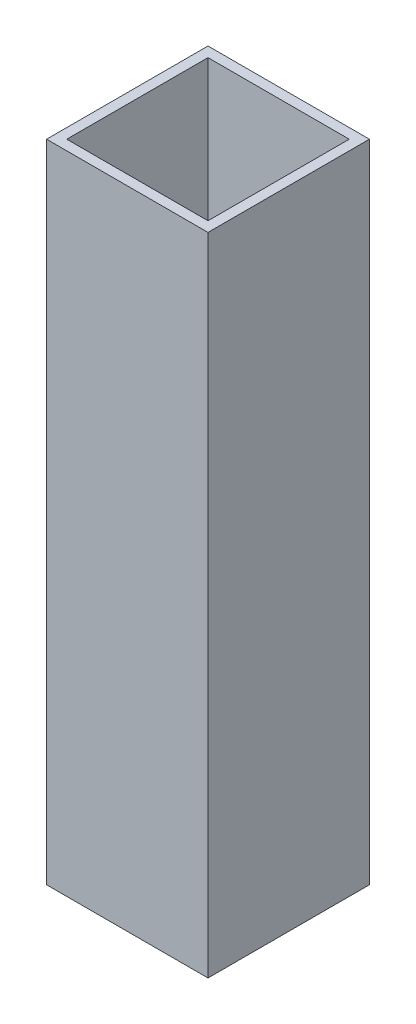
ISO-10303-21;
HEADER;
FILE_DESCRIPTION(('STEP AP214'),'2;1');
FILE_NAME('part.step','',(''),(''),'','','');
FILE_SCHEMA(('AUTOMOTIVE_DESIGN { 1 0 10303 214 1 1 1 1 }'));
ENDSEC;
DATA;
#1=APPLICATION_CONTEXT('core data for automotive mechanical design processes');
#2=APPLICATION_PROTOCOL_DEFINITION('international standard','automotive_design',2000,#1);
#3=PRODUCT_CONTEXT('',#1,'mechanical');
#4=PRODUCT('Part','Part','',(#3));
#5=PRODUCT_RELATED_PRODUCT_CATEGORY('part','',(#4));
#6=PRODUCT_DEFINITION_FORMATION('','',#4);
#7=PRODUCT_DEFINITION_CONTEXT('part definition',#1,'design');
#8=PRODUCT_DEFINITION('design','',#6,#7);
#9=PRODUCT_DEFINITION_SHAPE('','',#8);
#10=(LENGTH_UNIT() NAMED_UNIT(*) SI_UNIT(.MILLI.,.METRE.));
#11=(NAMED_UNIT(*) PLANE_ANGLE_UNIT() SI_UNIT($,.RADIAN.));
#12=(NAMED_UNIT(*) SI_UNIT($,.STERADIAN.) SOLID_ANGLE_UNIT());
#13=UNCERTAINTY_MEASURE_WITH_UNIT(LENGTH_MEASURE(1.E-05),#10,'distance_accuracy_value','');
#14=(GEOMETRIC_REPRESENTATION_CONTEXT(3) GLOBAL_UNCERTAINTY_ASSIGNED_CONTEXT((#13)) GLOBAL_UNIT_ASSIGNED_CONTEXT((#10,
#11,#12)) REPRESENTATION_CONTEXT('',''));
#15=CARTESIAN_POINT('',(0.,0.,0.));
#16=DIRECTION('',(0.,0.,1.));
#17=DIRECTION('',(1.,0.,0.));
#18=AXIS2_PLACEMENT_3D('',#15,#16,#17);
#19=CARTESIAN_POINT('',(0.,101.6,0.));
#20=DIRECTION('',(0.,-1.,0.));
#21=DIRECTION('',(0.,0.,-1.));
#22=AXIS2_PLACEMENT_3D('',#19,#20,#21);
#23=PLANE('',#22);
#24=DIRECTION('',(0.,0.,-1.));
#25=VECTOR('',#24,1.);
#26=CARTESIAN_POINT('',(12.7,101.6,12.7));
#27=LINE('',#26,#25);
#28=CARTESIAN_POINT('',(12.7,101.6,12.7));
#29=VERTEX_POINT('',#28);
#30=CARTESIAN_POINT('',(12.7,101.6,-12.7));
#31=VERTEX_POINT('',#30);
#32=EDGE_CURVE('E134',#29,#31,#27,.T.);
#33=ORIENTED_EDGE('',*,*,#32,.T.);
#34=DIRECTION('',(-1.,0.,0.));
#35=VECTOR('',#34,1.);
#36=CARTESIAN_POINT('',(-12.7,101.6,-12.7));
#37=LINE('',#36,#35);
#38=CARTESIAN_POINT('',(-12.7,101.6,-12.7));
#39=VERTEX_POINT('',#38);
#40=EDGE_CURVE('E137',#31,#39,#37,.T.);
#41=ORIENTED_EDGE('',*,*,#40,.T.);
#42=DIRECTION('',(0.,0.,1.));
#43=VECTOR('',#42,1.);
#44=CARTESIAN_POINT('',(-12.7,101.6,12.7));
#45=LINE('',#44,#43);
#46=CARTESIAN_POINT('',(-12.7,101.6,12.7));
#47=VERTEX_POINT('',#46);
#48=EDGE_CURVE('E140',#39,#47,#45,.T.);
#49=ORIENTED_EDGE('',*,*,#48,.T.);
#50=DIRECTION('',(1.,0.,0.));
#51=VECTOR('',#50,1.);
#52=CARTESIAN_POINT('',(-12.7,101.6,12.7));
#53=LINE('',#52,#51);
#54=EDGE_CURVE('E142',#47,#29,#53,.T.);
#55=ORIENTED_EDGE('',*,*,#54,.T.);
#56=EDGE_LOOP('',(#33,#41,#49,#55));
#57=FACE_BOUND('',#56,.T.);
#58=DIRECTION('',(0.,0.,-1.));
#59=VECTOR('',#58,1.);
#60=CARTESIAN_POINT('',(11.1125,101.6,11.1125));
#61=LINE('',#60,#59);
#62=CARTESIAN_POINT('',(11.1125,101.6,11.1125));
#63=VERTEX_POINT('',#62);
#64=CARTESIAN_POINT('',(11.1125,101.6,-11.1125));
#65=VERTEX_POINT('',#64);
#66=EDGE_CURVE('E98',#63,#65,#61,.T.);
#67=ORIENTED_EDGE('',*,*,#66,.F.);
#68=DIRECTION('',(1.,0.,0.));
#69=VECTOR('',#68,1.);
#70=CARTESIAN_POINT('',(-11.1125,101.6,11.1125));
#71=LINE('',#70,#69);
#72=CARTESIAN_POINT('',(-11.1125,101.6,11.1125));
#73=VERTEX_POINT('',#72);
#74=EDGE_CURVE('E120',#73,#63,#71,.T.);
#75=ORIENTED_EDGE('',*,*,#74,.F.);
#76=DIRECTION('',(0.,0.,1.));
#77=VECTOR('',#76,1.);
#78=CARTESIAN_POINT('',(-11.1125,101.6,11.1125));
#79=LINE('',#78,#77);
#80=CARTESIAN_POINT('',(-11.1125,101.6,-11.1125));
#81=VERTEX_POINT('',#80);
#82=EDGE_CURVE('E118',#81,#73,#79,.T.);
#83=ORIENTED_EDGE('',*,*,#82,.F.);
#84=DIRECTION('',(-1.,0.,0.));
#85=VECTOR('',#84,1.);
#86=CARTESIAN_POINT('',(-11.1125,101.6,-11.1125));
#87=LINE('',#86,#85);
#88=EDGE_CURVE('E106',#65,#81,#87,.T.);
#89=ORIENTED_EDGE('',*,*,#88,.F.);
#90=EDGE_LOOP('',(#67,#75,#83,#89));
#91=FACE_BOUND('',#90,.T.);
#92=ADVANCED_FACE('F33',(#57,#91),#23,.F.);
#93=CARTESIAN_POINT('',(0.,0.,0.));
#94=DIRECTION('',(0.,-1.,0.));
#95=DIRECTION('',(0.,0.,-1.));
#96=AXIS2_PLACEMENT_3D('',#93,#94,#95);
#97=PLANE('',#96);
#98=DIRECTION('',(0.,0.,-1.));
#99=VECTOR('',#98,1.);
#100=CARTESIAN_POINT('',(12.7,0.,12.7));
#101=LINE('',#100,#99);
#102=CARTESIAN_POINT('',(12.7,0.,12.7));
#103=VERTEX_POINT('',#102);
#104=CARTESIAN_POINT('',(12.7,0.,-12.7));
#105=VERTEX_POINT('',#104);
#106=EDGE_CURVE('E114',#103,#105,#101,.T.);
#107=ORIENTED_EDGE('',*,*,#106,.F.);
#108=DIRECTION('',(1.,0.,0.));
#109=VECTOR('',#108,1.);
#110=CARTESIAN_POINT('',(-12.7,0.,12.7));
#111=LINE('',#110,#109);
#112=CARTESIAN_POINT('',(-12.7,0.,12.7));
#113=VERTEX_POINT('',#112);
#114=EDGE_CURVE('E138',#113,#103,#111,.T.);
#115=ORIENTED_EDGE('',*,*,#114,.F.);
#116=DIRECTION('',(0.,0.,1.));
#117=VECTOR('',#116,1.);
#118=CARTESIAN_POINT('',(-12.7,0.,12.7));
#119=LINE('',#118,#117);
#120=CARTESIAN_POINT('',(-12.7,0.,-12.7));
#121=VERTEX_POINT('',#120);
#122=EDGE_CURVE('E149',#121,#113,#119,.T.);
#123=ORIENTED_EDGE('',*,*,#122,.F.);
#124=DIRECTION('',(-1.,0.,0.));
#125=VECTOR('',#124,1.);
#126=CARTESIAN_POINT('',(-12.7,0.,-12.7));
#127=LINE('',#126,#125);
#128=EDGE_CURVE('E147',#105,#121,#127,.T.);
#129=ORIENTED_EDGE('',*,*,#128,.F.);
#130=EDGE_LOOP('',(#107,#115,#123,#129));
#131=FACE_BOUND('',#130,.T.);
#132=DIRECTION('',(1.,0.,0.));
#133=VECTOR('',#132,1.);
#134=CARTESIAN_POINT('',(-11.1125,0.,11.1125));
#135=LINE('',#134,#133);
#136=CARTESIAN_POINT('',(-11.1125,0.,11.1125));
#137=VERTEX_POINT('',#136);
#138=CARTESIAN_POINT('',(11.1125,0.,11.1125));
#139=VERTEX_POINT('',#138);
#140=EDGE_CURVE('E107',#137,#139,#135,.T.);
#141=ORIENTED_EDGE('',*,*,#140,.T.);
#142=DIRECTION('',(0.,0.,-1.));
#143=VECTOR('',#142,1.);
#144=CARTESIAN_POINT('',(11.1125,0.,11.1125));
#145=LINE('',#144,#143);
#146=CARTESIAN_POINT('',(11.1125,0.,-11.1125));
#147=VERTEX_POINT('',#146);
#148=EDGE_CURVE('E56',#139,#147,#145,.T.);
#149=ORIENTED_EDGE('',*,*,#148,.T.);
#150=DIRECTION('',(-1.,0.,0.));
#151=VECTOR('',#150,1.);
#152=CARTESIAN_POINT('',(-11.1125,0.,-11.1125));
#153=LINE('',#152,#151);
#154=CARTESIAN_POINT('',(-11.1125,0.,-11.1125));
#155=VERTEX_POINT('',#154);
#156=EDGE_CURVE('E113',#147,#155,#153,.T.);
#157=ORIENTED_EDGE('',*,*,#156,.T.);
#158=DIRECTION('',(0.,0.,1.));
#159=VECTOR('',#158,1.);
#160=CARTESIAN_POINT('',(-11.1125,0.,11.1125));
#161=LINE('',#160,#159);
#162=EDGE_CURVE('E126',#155,#137,#161,.T.);
#163=ORIENTED_EDGE('',*,*,#162,.T.);
#164=EDGE_LOOP('',(#141,#149,#157,#163));
#165=FACE_BOUND('',#164,.T.);
#166=ADVANCED_FACE('F167',(#131,#165),#97,.T.);
#167=CARTESIAN_POINT('',(12.7,101.6,12.7));
#168=DIRECTION('',(-1.,0.,0.));
#169=DIRECTION('',(0.,0.,1.));
#170=AXIS2_PLACEMENT_3D('',#167,#168,#169);
#171=PLANE('',#170);
#172=ORIENTED_EDGE('',*,*,#106,.T.);
#173=DIRECTION('',(0.,-1.,0.));
#174=VECTOR('',#173,1.);
#175=CARTESIAN_POINT('',(12.7,101.6,-12.7));
#176=LINE('',#175,#174);
#177=EDGE_CURVE('E11',#31,#105,#176,.T.);
#178=ORIENTED_EDGE('',*,*,#177,.F.);
#179=ORIENTED_EDGE('',*,*,#32,.F.);
#180=DIRECTION('',(0.,-1.,0.));
#181=VECTOR('',#180,1.);
#182=CARTESIAN_POINT('',(12.7,101.6,12.7));
#183=LINE('',#182,#181);
#184=EDGE_CURVE('E144',#29,#103,#183,.T.);
#185=ORIENTED_EDGE('',*,*,#184,.T.);
#186=EDGE_LOOP('',(#172,#178,#179,#185));
#187=FACE_BOUND('',#186,.T.);
#188=ADVANCED_FACE('F35',(#187),#171,.F.);
#189=CARTESIAN_POINT('',(-12.7,101.6,-12.7));
#190=DIRECTION('',(0.,0.,1.));
#191=DIRECTION('',(1.,0.,0.));
#192=AXIS2_PLACEMENT_3D('',#189,#190,#191);
#193=PLANE('',#192);
#194=ORIENTED_EDGE('',*,*,#128,.T.);
#195=DIRECTION('',(0.,-1.,0.));
#196=VECTOR('',#195,1.);
#197=CARTESIAN_POINT('',(-12.7,101.6,-12.7));
#198=LINE('',#197,#196);
#199=EDGE_CURVE('E41',#39,#121,#198,.T.);
#200=ORIENTED_EDGE('',*,*,#199,.F.);
#201=ORIENTED_EDGE('',*,*,#40,.F.);
#202=ORIENTED_EDGE('',*,*,#177,.T.);
#203=EDGE_LOOP('',(#194,#200,#201,#202));
#204=FACE_BOUND('',#203,.T.);
#205=ADVANCED_FACE('F177',(#204),#193,.F.);
#206=CARTESIAN_POINT('',(-12.7,101.6,12.7));
#207=DIRECTION('',(1.,0.,0.));
#208=DIRECTION('',(0.,0.,-1.));
#209=AXIS2_PLACEMENT_3D('',#206,#207,#208);
#210=PLANE('',#209);
#211=ORIENTED_EDGE('',*,*,#122,.T.);
#212=DIRECTION('',(0.,-1.,0.));
#213=VECTOR('',#212,1.);
#214=CARTESIAN_POINT('',(-12.7,101.6,12.7));
#215=LINE('',#214,#213);
#216=EDGE_CURVE('E154',#47,#113,#215,.T.);
#217=ORIENTED_EDGE('',*,*,#216,.F.);
#218=ORIENTED_EDGE('',*,*,#48,.F.);
#219=ORIENTED_EDGE('',*,*,#199,.T.);
#220=EDGE_LOOP('',(#211,#217,#218,#219));
#221=FACE_BOUND('',#220,.T.);
#222=ADVANCED_FACE('F161',(#221),#210,.F.);
#223=CARTESIAN_POINT('',(-12.7,101.6,12.7));
#224=DIRECTION('',(0.,0.,-1.));
#225=DIRECTION('',(-1.,0.,0.));
#226=AXIS2_PLACEMENT_3D('',#223,#224,#225);
#227=PLANE('',#226);
#228=ORIENTED_EDGE('',*,*,#114,.T.);
#229=ORIENTED_EDGE('',*,*,#184,.F.);
#230=ORIENTED_EDGE('',*,*,#54,.F.);
#231=ORIENTED_EDGE('',*,*,#216,.T.);
#232=EDGE_LOOP('',(#228,#229,#230,#231));
#233=FACE_BOUND('',#232,.T.);
#234=ADVANCED_FACE('F171',(#233),#227,.F.);
#235=CARTESIAN_POINT('',(11.1125,101.6,11.1125));
#236=DIRECTION('',(-1.,0.,0.));
#237=DIRECTION('',(0.,0.,1.));
#238=AXIS2_PLACEMENT_3D('',#235,#236,#237);
#239=PLANE('',#238);
#240=ORIENTED_EDGE('',*,*,#148,.F.);
#241=DIRECTION('',(0.,-1.,0.));
#242=VECTOR('',#241,1.);
#243=CARTESIAN_POINT('',(11.1125,101.6,11.1125));
#244=LINE('',#243,#242);
#245=EDGE_CURVE('E102',#63,#139,#244,.T.);
#246=ORIENTED_EDGE('',*,*,#245,.F.);
#247=ORIENTED_EDGE('',*,*,#66,.T.);
#248=DIRECTION('',(0.,-1.,0.));
#249=VECTOR('',#248,1.);
#250=CARTESIAN_POINT('',(11.1125,101.6,-11.1125));
#251=LINE('',#250,#249);
#252=EDGE_CURVE('E101',#65,#147,#251,.T.);
#253=ORIENTED_EDGE('',*,*,#252,.T.);
#254=EDGE_LOOP('',(#240,#246,#247,#253));
#255=FACE_BOUND('',#254,.T.);
#256=ADVANCED_FACE('F100',(#255),#239,.T.);
#257=CARTESIAN_POINT('',(-11.1125,101.6,-11.1125));
#258=DIRECTION('',(0.,0.,1.));
#259=DIRECTION('',(1.,0.,0.));
#260=AXIS2_PLACEMENT_3D('',#257,#258,#259);
#261=PLANE('',#260);
#262=ORIENTED_EDGE('',*,*,#156,.F.);
#263=ORIENTED_EDGE('',*,*,#252,.F.);
#264=ORIENTED_EDGE('',*,*,#88,.T.);
#265=DIRECTION('',(0.,-1.,0.));
#266=VECTOR('',#265,1.);
#267=CARTESIAN_POINT('',(-11.1125,101.6,-11.1125));
#268=LINE('',#267,#266);
#269=EDGE_CURVE('E115',#81,#155,#268,.T.);
#270=ORIENTED_EDGE('',*,*,#269,.T.);
#271=EDGE_LOOP('',(#262,#263,#264,#270));
#272=FACE_BOUND('',#271,.T.);
#273=ADVANCED_FACE('F110',(#272),#261,.T.);
#274=CARTESIAN_POINT('',(-11.1125,101.6,11.1125));
#275=DIRECTION('',(1.,0.,0.));
#276=DIRECTION('',(0.,0.,-1.));
#277=AXIS2_PLACEMENT_3D('',#274,#275,#276);
#278=PLANE('',#277);
#279=ORIENTED_EDGE('',*,*,#162,.F.);
#280=ORIENTED_EDGE('',*,*,#269,.F.);
#281=ORIENTED_EDGE('',*,*,#82,.T.);
#282=DIRECTION('',(0.,-1.,0.));
#283=VECTOR('',#282,1.);
#284=CARTESIAN_POINT('',(-11.1125,101.6,11.1125));
#285=LINE('',#284,#283);
#286=EDGE_CURVE('E48',#73,#137,#285,.T.);
#287=ORIENTED_EDGE('',*,*,#286,.T.);
#288=EDGE_LOOP('',(#279,#280,#281,#287));
#289=FACE_BOUND('',#288,.T.);
#290=ADVANCED_FACE('F200',(#289),#278,.T.);
#291=CARTESIAN_POINT('',(-11.1125,101.6,11.1125));
#292=DIRECTION('',(0.,0.,-1.));
#293=DIRECTION('',(-1.,0.,0.));
#294=AXIS2_PLACEMENT_3D('',#291,#292,#293);
#295=PLANE('',#294);
#296=ORIENTED_EDGE('',*,*,#140,.F.);
#297=ORIENTED_EDGE('',*,*,#286,.F.);
#298=ORIENTED_EDGE('',*,*,#74,.T.);
#299=ORIENTED_EDGE('',*,*,#245,.T.);
#300=EDGE_LOOP('',(#296,#297,#298,#299));
#301=FACE_BOUND('',#300,.T.);
#302=ADVANCED_FACE('F204',(#301),#295,.T.);
#303=CLOSED_SHELL('',(#92,#166,#188,#205,#222,#234,#256,#273,#290,#302));
#304=MANIFOLD_SOLID_BREP('B2',#303);
#305=ADVANCED_BREP_SHAPE_REPRESENTATION('',(#18,#304),#14);
#306=SHAPE_DEFINITION_REPRESENTATION(#9,#305);
ENDSEC;
END-ISO-10303-21;
